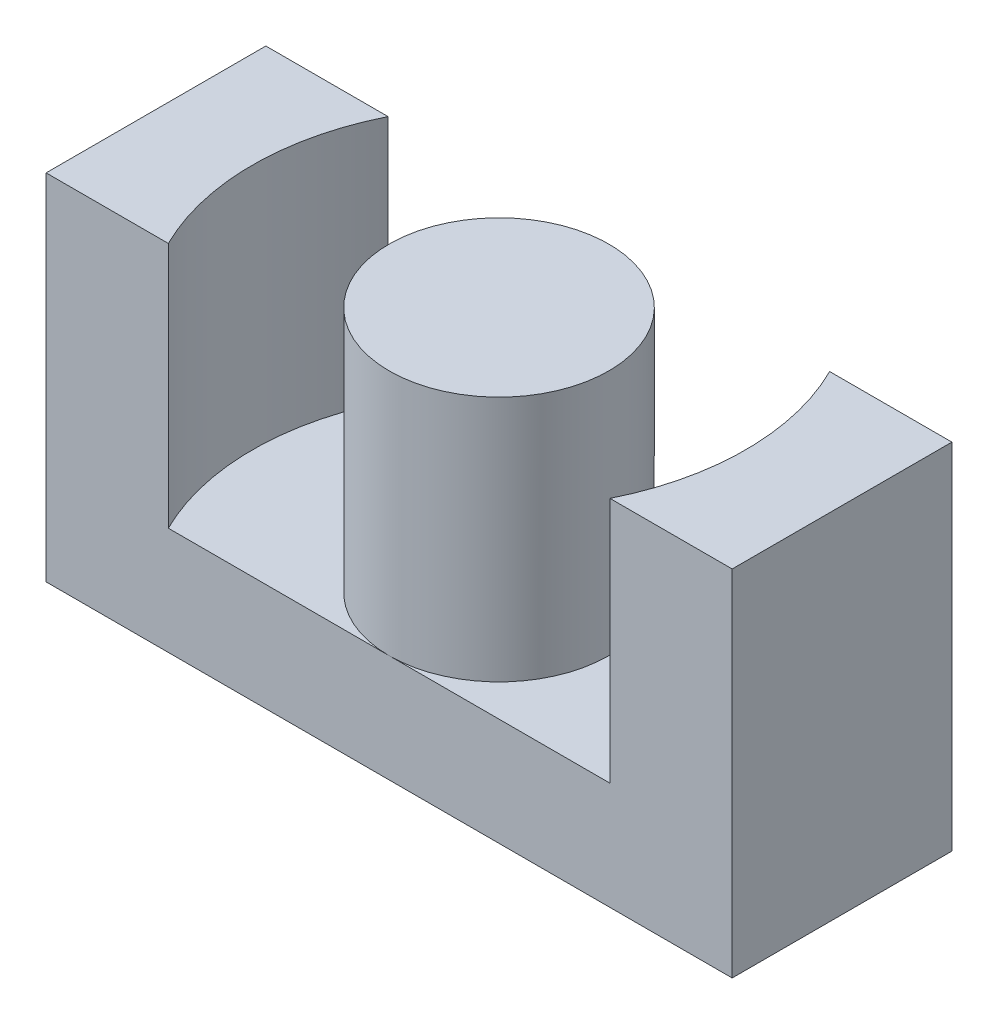
ISO-10303-21;
HEADER;
FILE_DESCRIPTION(('STEP AP214'),'2;1');
FILE_NAME('part.step','',(''),(''),'','','');
FILE_SCHEMA(('AUTOMOTIVE_DESIGN { 1 0 10303 214 1 1 1 1 }'));
ENDSEC;
DATA;
#1=APPLICATION_CONTEXT('core data for automotive mechanical design processes');
#2=APPLICATION_PROTOCOL_DEFINITION('international standard','automotive_design',2000,#1);
#3=PRODUCT_CONTEXT('',#1,'mechanical');
#4=PRODUCT('Part','Part','',(#3));
#5=PRODUCT_RELATED_PRODUCT_CATEGORY('part','',(#4));
#6=PRODUCT_DEFINITION_FORMATION('','',#4);
#7=PRODUCT_DEFINITION_CONTEXT('part definition',#1,'design');
#8=PRODUCT_DEFINITION('design','',#6,#7);
#9=PRODUCT_DEFINITION_SHAPE('','',#8);
#10=(LENGTH_UNIT() NAMED_UNIT(*) SI_UNIT(.MILLI.,.METRE.));
#11=(NAMED_UNIT(*) PLANE_ANGLE_UNIT() SI_UNIT($,.RADIAN.));
#12=(NAMED_UNIT(*) SI_UNIT($,.STERADIAN.) SOLID_ANGLE_UNIT());
#13=UNCERTAINTY_MEASURE_WITH_UNIT(LENGTH_MEASURE(1.E-05),#10,'distance_accuracy_value','');
#14=(GEOMETRIC_REPRESENTATION_CONTEXT(3) GLOBAL_UNCERTAINTY_ASSIGNED_CONTEXT((#13)) GLOBAL_UNIT_ASSIGNED_CONTEXT((#10,
#11,#12)) REPRESENTATION_CONTEXT('',''));
#15=CARTESIAN_POINT('',(0.,0.,0.));
#16=DIRECTION('',(0.,0.,1.));
#17=DIRECTION('',(1.,0.,0.));
#18=AXIS2_PLACEMENT_3D('',#15,#16,#17);
#19=CARTESIAN_POINT('',(-15.3,15.8,4.90000000000001));
#20=DIRECTION('',(0.,1.,0.));
#21=DIRECTION('',(0.,0.,1.));
#22=AXIS2_PLACEMENT_3D('',#19,#20,#21);
#23=PLANE('',#22);
#24=CARTESIAN_POINT('',(0.,15.8,0.));
#25=DIRECTION('',(0.,1.,0.));
#26=DIRECTION('',(0.,0.,1.));
#27=AXIS2_PLACEMENT_3D('',#24,#25,#26);
#28=CIRCLE('',#27,11.);
#29=CARTESIAN_POINT('',(9.8483501156285,15.8,4.9));
#30=VERTEX_POINT('',#29);
#31=CARTESIAN_POINT('',(9.8483501156285,15.8,-4.9));
#32=VERTEX_POINT('',#31);
#33=EDGE_CURVE('E128',#30,#32,#28,.T.);
#34=ORIENTED_EDGE('',*,*,#33,.F.);
#35=DIRECTION('',(1.,0.,0.));
#36=VECTOR('',#35,1.);
#37=CARTESIAN_POINT('',(-15.3,15.8,4.90000000000001));
#38=LINE('',#37,#36);
#39=CARTESIAN_POINT('',(15.3,15.8,4.9));
#40=VERTEX_POINT('',#39);
#41=EDGE_CURVE('E147',#30,#40,#38,.T.);
#42=ORIENTED_EDGE('',*,*,#41,.T.);
#43=DIRECTION('',(0.,0.,-1.));
#44=VECTOR('',#43,1.);
#45=CARTESIAN_POINT('',(15.3,15.8,-4.9));
#46=LINE('',#45,#44);
#47=CARTESIAN_POINT('',(15.3,15.8,-4.9));
#48=VERTEX_POINT('',#47);
#49=EDGE_CURVE('E151',#40,#48,#46,.T.);
#50=ORIENTED_EDGE('',*,*,#49,.T.);
#51=DIRECTION('',(-1.,0.,0.));
#52=VECTOR('',#51,1.);
#53=CARTESIAN_POINT('',(-15.3,15.8,-4.9));
#54=LINE('',#53,#52);
#55=EDGE_CURVE('E153',#48,#32,#54,.T.);
#56=ORIENTED_EDGE('',*,*,#55,.T.);
#57=EDGE_LOOP('',(#34,#42,#50,#56));
#58=FACE_BOUND('',#57,.T.);
#59=ADVANCED_FACE('F32',(#58),#23,.T.);
#60=CARTESIAN_POINT('',(-15.3,15.8,-4.9));
#61=DIRECTION('',(1.,0.,0.));
#62=DIRECTION('',(0.,0.,-1.));
#63=AXIS2_PLACEMENT_3D('',#60,#61,#62);
#64=PLANE('',#63);
#65=DIRECTION('',(0.,0.,1.));
#66=VECTOR('',#65,1.);
#67=CARTESIAN_POINT('',(-15.3,0.,-4.9));
#68=LINE('',#67,#66);
#69=CARTESIAN_POINT('',(-15.3,0.,-4.9));
#70=VERTEX_POINT('',#69);
#71=CARTESIAN_POINT('',(-15.3,0.,4.9));
#72=VERTEX_POINT('',#71);
#73=EDGE_CURVE('E114',#70,#72,#68,.T.);
#74=ORIENTED_EDGE('',*,*,#73,.T.);
#75=DIRECTION('',(0.,-1.,0.));
#76=VECTOR('',#75,1.);
#77=CARTESIAN_POINT('',(-15.3,15.8,4.90000000000001));
#78=LINE('',#77,#76);
#79=CARTESIAN_POINT('',(-15.3,15.8,4.90000000000001));
#80=VERTEX_POINT('',#79);
#81=EDGE_CURVE('E165',#80,#72,#78,.T.);
#82=ORIENTED_EDGE('',*,*,#81,.F.);
#83=DIRECTION('',(0.,0.,1.));
#84=VECTOR('',#83,1.);
#85=CARTESIAN_POINT('',(-15.3,15.8,-4.9));
#86=LINE('',#85,#84);
#87=CARTESIAN_POINT('',(-15.3,15.8,-4.9));
#88=VERTEX_POINT('',#87);
#89=EDGE_CURVE('E145',#88,#80,#86,.T.);
#90=ORIENTED_EDGE('',*,*,#89,.F.);
#91=DIRECTION('',(0.,-1.,0.));
#92=VECTOR('',#91,1.);
#93=CARTESIAN_POINT('',(-15.3,15.8,-4.9));
#94=LINE('',#93,#92);
#95=EDGE_CURVE('E156',#88,#70,#94,.T.);
#96=ORIENTED_EDGE('',*,*,#95,.T.);
#97=EDGE_LOOP('',(#74,#82,#90,#96));
#98=FACE_BOUND('',#97,.T.);
#99=ADVANCED_FACE('F34',(#98),#64,.F.);
#100=CARTESIAN_POINT('',(-15.3,15.8,4.90000000000001));
#101=DIRECTION('',(0.,0.,-1.));
#102=DIRECTION('',(-1.,0.,0.));
#103=AXIS2_PLACEMENT_3D('',#100,#101,#102);
#104=PLANE('',#103);
#105=DIRECTION('',(1.,0.,0.));
#106=VECTOR('',#105,1.);
#107=CARTESIAN_POINT('',(-15.3,4.80000000000001,4.9));
#108=LINE('',#107,#106);
#109=CARTESIAN_POINT('',(-9.8483501156285,4.80000000000001,4.90000000000001));
#110=VERTEX_POINT('',#109);
#111=CARTESIAN_POINT('',(0.,4.80000000000001,4.9));
#112=VERTEX_POINT('',#111);
#113=EDGE_CURVE('E105',#110,#112,#108,.T.);
#114=ORIENTED_EDGE('',*,*,#113,.F.);
#115=DIRECTION('',(0.,1.,0.));
#116=VECTOR('',#115,1.);
#117=CARTESIAN_POINT('',(-9.8483501156285,4.80000000000001,4.90000000000001));
#118=LINE('',#117,#116);
#119=CARTESIAN_POINT('',(-9.8483501156285,15.8,4.9));
#120=VERTEX_POINT('',#119);
#121=EDGE_CURVE('E133',#110,#120,#118,.T.);
#122=ORIENTED_EDGE('',*,*,#121,.T.);
#123=EDGE_CURVE('E148',#80,#120,#38,.T.);
#124=ORIENTED_EDGE('',*,*,#123,.F.);
#125=ORIENTED_EDGE('',*,*,#81,.T.);
#126=DIRECTION('',(1.,0.,0.));
#127=VECTOR('',#126,1.);
#128=CARTESIAN_POINT('',(-15.3,0.,4.9));
#129=LINE('',#128,#127);
#130=CARTESIAN_POINT('',(15.3,0.,4.9));
#131=VERTEX_POINT('',#130);
#132=EDGE_CURVE('E139',#72,#131,#129,.T.);
#133=ORIENTED_EDGE('',*,*,#132,.T.);
#134=DIRECTION('',(0.,-1.,0.));
#135=VECTOR('',#134,1.);
#136=CARTESIAN_POINT('',(15.3,15.8,4.9));
#137=LINE('',#136,#135);
#138=EDGE_CURVE('E162',#40,#131,#137,.T.);
#139=ORIENTED_EDGE('',*,*,#138,.F.);
#140=ORIENTED_EDGE('',*,*,#41,.F.);
#141=DIRECTION('',(0.,1.,0.));
#142=VECTOR('',#141,1.);
#143=CARTESIAN_POINT('',(9.8483501156285,4.80000000000001,4.9));
#144=LINE('',#143,#142);
#145=CARTESIAN_POINT('',(9.8483501156285,4.80000000000001,4.9));
#146=VERTEX_POINT('',#145);
#147=EDGE_CURVE('E132',#30,#146,#144,.F.);
#148=ORIENTED_EDGE('',*,*,#147,.T.);
#149=EDGE_CURVE('E115',#112,#146,#108,.T.);
#150=ORIENTED_EDGE('',*,*,#149,.F.);
#151=EDGE_LOOP('',(#114,#122,#124,#125,#133,#139,#140,#148,#150));
#152=FACE_BOUND('',#151,.T.);
#153=ADVANCED_FACE('F130',(#152),#104,.F.);
#154=CARTESIAN_POINT('',(15.3,15.8,-4.9));
#155=DIRECTION('',(-1.,0.,0.));
#156=DIRECTION('',(0.,0.,1.));
#157=AXIS2_PLACEMENT_3D('',#154,#155,#156);
#158=PLANE('',#157);
#159=DIRECTION('',(0.,0.,-1.));
#160=VECTOR('',#159,1.);
#161=CARTESIAN_POINT('',(15.3,0.,-4.9));
#162=LINE('',#161,#160);
#163=CARTESIAN_POINT('',(15.3,0.,-4.9));
#164=VERTEX_POINT('',#163);
#165=EDGE_CURVE('E141',#131,#164,#162,.T.);
#166=ORIENTED_EDGE('',*,*,#165,.T.);
#167=DIRECTION('',(0.,-1.,0.));
#168=VECTOR('',#167,1.);
#169=CARTESIAN_POINT('',(15.3,15.8,-4.9));
#170=LINE('',#169,#168);
#171=EDGE_CURVE('E159',#48,#164,#170,.T.);
#172=ORIENTED_EDGE('',*,*,#171,.F.);
#173=ORIENTED_EDGE('',*,*,#49,.F.);
#174=ORIENTED_EDGE('',*,*,#138,.T.);
#175=EDGE_LOOP('',(#166,#172,#173,#174));
#176=FACE_BOUND('',#175,.T.);
#177=ADVANCED_FACE('F190',(#176),#158,.F.);
#178=CARTESIAN_POINT('',(-15.3,15.8,-4.9));
#179=DIRECTION('',(0.,0.,1.));
#180=DIRECTION('',(1.,0.,0.));
#181=AXIS2_PLACEMENT_3D('',#178,#179,#180);
#182=PLANE('',#181);
#183=DIRECTION('',(-1.,0.,0.));
#184=VECTOR('',#183,1.);
#185=CARTESIAN_POINT('',(-15.3,4.8,-4.9));
#186=LINE('',#185,#184);
#187=CARTESIAN_POINT('',(9.8483501156285,4.8,-4.9));
#188=VERTEX_POINT('',#187);
#189=CARTESIAN_POINT('',(0.,4.8,-4.9));
#190=VERTEX_POINT('',#189);
#191=EDGE_CURVE('E11',#188,#190,#186,.T.);
#192=ORIENTED_EDGE('',*,*,#191,.F.);
#193=DIRECTION('',(0.,1.,0.));
#194=VECTOR('',#193,1.);
#195=CARTESIAN_POINT('',(9.8483501156285,4.8,-4.9));
#196=LINE('',#195,#194);
#197=EDGE_CURVE('E176',#188,#32,#196,.T.);
#198=ORIENTED_EDGE('',*,*,#197,.T.);
#199=ORIENTED_EDGE('',*,*,#55,.F.);
#200=ORIENTED_EDGE('',*,*,#171,.T.);
#201=DIRECTION('',(-1.,0.,0.));
#202=VECTOR('',#201,1.);
#203=CARTESIAN_POINT('',(-15.3,0.,-4.9));
#204=LINE('',#203,#202);
#205=EDGE_CURVE('E143',#164,#70,#204,.T.);
#206=ORIENTED_EDGE('',*,*,#205,.T.);
#207=ORIENTED_EDGE('',*,*,#95,.F.);
#208=CARTESIAN_POINT('',(-9.84835011562851,15.8,-4.9));
#209=VERTEX_POINT('',#208);
#210=EDGE_CURVE('E54',#209,#88,#54,.T.);
#211=ORIENTED_EDGE('',*,*,#210,.F.);
#212=DIRECTION('',(0.,1.,0.));
#213=VECTOR('',#212,1.);
#214=CARTESIAN_POINT('',(-9.8483501156285,4.8,-4.89999999999999));
#215=LINE('',#214,#213);
#216=CARTESIAN_POINT('',(-9.8483501156285,4.8,-4.89999999999999));
#217=VERTEX_POINT('',#216);
#218=EDGE_CURVE('E47',#209,#217,#215,.F.);
#219=ORIENTED_EDGE('',*,*,#218,.T.);
#220=EDGE_CURVE('E36',#190,#217,#186,.T.);
#221=ORIENTED_EDGE('',*,*,#220,.F.);
#222=EDGE_LOOP('',(#192,#198,#199,#200,#206,#207,#211,#219,#221));
#223=FACE_BOUND('',#222,.T.);
#224=ADVANCED_FACE('F175',(#223),#182,.F.);
#225=CARTESIAN_POINT('',(0.,15.8,0.));
#226=DIRECTION('',(0.,1.,0.));
#227=DIRECTION('',(0.,0.,1.));
#228=AXIS2_PLACEMENT_3D('',#225,#226,#227);
#229=CIRCLE('',#228,11.);
#230=EDGE_CURVE('E170',#209,#120,#229,.T.);
#231=ORIENTED_EDGE('',*,*,#230,.F.);
#232=ORIENTED_EDGE('',*,*,#210,.T.);
#233=ORIENTED_EDGE('',*,*,#89,.T.);
#234=ORIENTED_EDGE('',*,*,#123,.T.);
#235=EDGE_LOOP('',(#231,#232,#233,#234));
#236=FACE_BOUND('',#235,.T.);
#237=ADVANCED_FACE('F199',(#236),#23,.T.);
#238=CARTESIAN_POINT('',(-15.3,0.,4.9));
#239=DIRECTION('',(0.,1.,0.));
#240=DIRECTION('',(0.,0.,1.));
#241=AXIS2_PLACEMENT_3D('',#238,#239,#240);
#242=PLANE('',#241);
#243=ORIENTED_EDGE('',*,*,#73,.F.);
#244=ORIENTED_EDGE('',*,*,#205,.F.);
#245=ORIENTED_EDGE('',*,*,#165,.F.);
#246=ORIENTED_EDGE('',*,*,#132,.F.);
#247=EDGE_LOOP('',(#243,#244,#245,#246));
#248=FACE_BOUND('',#247,.T.);
#249=ADVANCED_FACE('F195',(#248),#242,.F.);
#250=CARTESIAN_POINT('',(0.,4.80000000000001,0.));
#251=DIRECTION('',(0.,1.,0.));
#252=DIRECTION('',(0.,0.,1.));
#253=AXIS2_PLACEMENT_3D('',#250,#251,#252);
#254=PLANE('',#253);
#255=ORIENTED_EDGE('',*,*,#113,.T.);
#256=CARTESIAN_POINT('',(0.,4.80000000000001,0.));
#257=DIRECTION('',(0.,1.,0.));
#258=DIRECTION('',(0.,0.,1.));
#259=AXIS2_PLACEMENT_3D('',#256,#257,#258);
#260=CIRCLE('',#259,4.9);
#261=EDGE_CURVE('E108',#190,#112,#260,.T.);
#262=ORIENTED_EDGE('',*,*,#261,.F.);
#263=ORIENTED_EDGE('',*,*,#220,.T.);
#264=CARTESIAN_POINT('',(0.,4.80000000000001,0.));
#265=DIRECTION('',(0.,1.,0.));
#266=DIRECTION('',(0.,0.,1.));
#267=AXIS2_PLACEMENT_3D('',#264,#265,#266);
#268=CIRCLE('',#267,11.);
#269=EDGE_CURVE('E110',#217,#110,#268,.T.);
#270=ORIENTED_EDGE('',*,*,#269,.T.);
#271=EDGE_LOOP('',(#255,#262,#263,#270));
#272=FACE_BOUND('',#271,.T.);
#273=ADVANCED_FACE('F107',(#272),#254,.T.);
#274=ORIENTED_EDGE('',*,*,#149,.T.);
#275=EDGE_CURVE('E173',#146,#188,#268,.T.);
#276=ORIENTED_EDGE('',*,*,#275,.T.);
#277=ORIENTED_EDGE('',*,*,#191,.T.);
#278=EDGE_CURVE('E120',#112,#190,#260,.T.);
#279=ORIENTED_EDGE('',*,*,#278,.F.);
#280=EDGE_LOOP('',(#274,#276,#277,#279));
#281=FACE_BOUND('',#280,.T.);
#282=ADVANCED_FACE('F124',(#281),#254,.T.);
#283=CARTESIAN_POINT('',(0.,4.80000000000001,0.));
#284=DIRECTION('',(0.,1.,0.));
#285=DIRECTION('',(0.,0.,1.));
#286=AXIS2_PLACEMENT_3D('',#283,#284,#285);
#287=CYLINDRICAL_SURFACE('',#286,11.);
#288=ORIENTED_EDGE('',*,*,#269,.F.);
#289=ORIENTED_EDGE('',*,*,#218,.F.);
#290=ORIENTED_EDGE('',*,*,#230,.T.);
#291=ORIENTED_EDGE('',*,*,#121,.F.);
#292=EDGE_LOOP('',(#288,#289,#290,#291));
#293=FACE_BOUND('',#292,.T.);
#294=ADVANCED_FACE('F172',(#293),#287,.F.);
#295=ORIENTED_EDGE('',*,*,#33,.T.);
#296=ORIENTED_EDGE('',*,*,#197,.F.);
#297=ORIENTED_EDGE('',*,*,#275,.F.);
#298=ORIENTED_EDGE('',*,*,#147,.F.);
#299=EDGE_LOOP('',(#295,#296,#297,#298));
#300=FACE_BOUND('',#299,.T.);
#301=ADVANCED_FACE('F183',(#300),#287,.F.);
#302=CARTESIAN_POINT('',(0.,4.80000000000001,0.));
#303=DIRECTION('',(0.,1.,0.));
#304=DIRECTION('',(0.,0.,1.));
#305=AXIS2_PLACEMENT_3D('',#302,#303,#304);
#306=CYLINDRICAL_SURFACE('',#305,4.9);
#307=CARTESIAN_POINT('',(0.,15.8,0.));
#308=DIRECTION('',(0.,1.,0.));
#309=DIRECTION('',(0.,0.,1.));
#310=AXIS2_PLACEMENT_3D('',#307,#308,#309);
#311=CIRCLE('',#310,4.9);
#312=CARTESIAN_POINT('',(0.,15.8,4.9));
#313=VERTEX_POINT('',#312);
#314=EDGE_CURVE('E168',#313,#313,#311,.T.);
#315=ORIENTED_EDGE('',*,*,#314,.F.);
#316=EDGE_LOOP('',(#315));
#317=FACE_BOUND('',#316,.T.);
#318=ORIENTED_EDGE('',*,*,#261,.T.);
#319=ORIENTED_EDGE('',*,*,#278,.T.);
#320=EDGE_LOOP('',(#318,#319));
#321=FACE_BOUND('',#320,.T.);
#322=ADVANCED_FACE('F119',(#317,#321),#306,.T.);
#323=ORIENTED_EDGE('',*,*,#314,.T.);
#324=EDGE_LOOP('',(#323));
#325=FACE_BOUND('',#324,.T.);
#326=ADVANCED_FACE('F202',(#325),#23,.T.);
#327=CLOSED_SHELL('',(#59,#99,#153,#177,#224,#237,#249,#273,#282,#294,#301,#322,#326));
#328=MANIFOLD_SOLID_BREP('B2',#327);
#329=ADVANCED_BREP_SHAPE_REPRESENTATION('',(#18,#328),#14);
#330=SHAPE_DEFINITION_REPRESENTATION(#9,#329);
ENDSEC;
END-ISO-10303-21;
